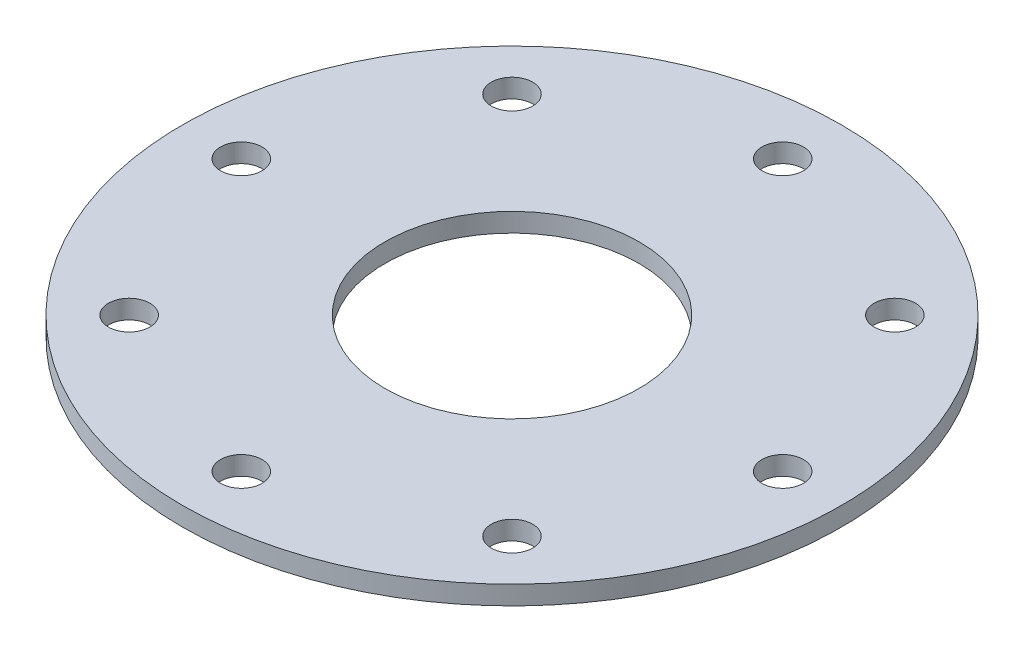
ISO-10303-21;
HEADER;
FILE_DESCRIPTION(('STEP AP214'),'2;1');
FILE_NAME('part.step','',(''),(''),'','','');
FILE_SCHEMA(('AUTOMOTIVE_DESIGN { 1 0 10303 214 1 1 1 1 }'));
ENDSEC;
DATA;
#1=APPLICATION_CONTEXT('core data for automotive mechanical design processes');
#2=APPLICATION_PROTOCOL_DEFINITION('international standard','automotive_design',2000,#1);
#3=PRODUCT_CONTEXT('',#1,'mechanical');
#4=PRODUCT('Part','Part','',(#3));
#5=PRODUCT_RELATED_PRODUCT_CATEGORY('part','',(#4));
#6=PRODUCT_DEFINITION_FORMATION('','',#4);
#7=PRODUCT_DEFINITION_CONTEXT('part definition',#1,'design');
#8=PRODUCT_DEFINITION('design','',#6,#7);
#9=PRODUCT_DEFINITION_SHAPE('','',#8);
#10=(LENGTH_UNIT() NAMED_UNIT(*) SI_UNIT(.MILLI.,.METRE.));
#11=(NAMED_UNIT(*) PLANE_ANGLE_UNIT() SI_UNIT($,.RADIAN.));
#12=(NAMED_UNIT(*) SI_UNIT($,.STERADIAN.) SOLID_ANGLE_UNIT());
#13=UNCERTAINTY_MEASURE_WITH_UNIT(LENGTH_MEASURE(1.E-05),#10,'distance_accuracy_value','');
#14=(GEOMETRIC_REPRESENTATION_CONTEXT(3) GLOBAL_UNCERTAINTY_ASSIGNED_CONTEXT((#13)) GLOBAL_UNIT_ASSIGNED_CONTEXT((#10,
#11,#12)) REPRESENTATION_CONTEXT('',''));
#15=CARTESIAN_POINT('',(0.,0.,0.));
#16=DIRECTION('',(0.,0.,1.));
#17=DIRECTION('',(1.,0.,0.));
#18=AXIS2_PLACEMENT_3D('',#15,#16,#17);
#19=CARTESIAN_POINT('',(0.,4.,0.));
#20=DIRECTION('',(0.,1.,0.));
#21=DIRECTION('',(0.,0.,1.));
#22=AXIS2_PLACEMENT_3D('',#19,#20,#21);
#23=PLANE('',#22);
#24=CARTESIAN_POINT('',(6.0228053095044E-13,4.,-57.5));
#25=DIRECTION('',(0.,1.,0.));
#26=DIRECTION('',(0.,0.,1.));
#27=AXIS2_PLACEMENT_3D('',#24,#25,#26);
#28=CIRCLE('',#27,4.4);
#29=CARTESIAN_POINT('',(6.0228053095044E-13,4.,-53.1));
#30=VERTEX_POINT('',#29);
#31=EDGE_CURVE('E88',#30,#30,#28,.T.);
#32=ORIENTED_EDGE('',*,*,#31,.F.);
#33=EDGE_LOOP('',(#32));
#34=FACE_BOUND('',#33,.T.);
#35=CARTESIAN_POINT('',(-57.5,4.,-4.1286418728248E-13));
#36=DIRECTION('',(0.,1.,0.));
#37=DIRECTION('',(0.,0.,1.));
#38=AXIS2_PLACEMENT_3D('',#35,#36,#37);
#39=CIRCLE('',#38,4.4);
#40=CARTESIAN_POINT('',(-57.5,4.,4.39999999999959));
#41=VERTEX_POINT('',#40);
#42=EDGE_CURVE('E76',#41,#41,#39,.T.);
#43=ORIENTED_EDGE('',*,*,#42,.F.);
#44=EDGE_LOOP('',(#43));
#45=FACE_BOUND('',#44,.T.);
#46=CARTESIAN_POINT('',(-1.03736463863413E-12,4.,57.5));
#47=DIRECTION('',(0.,1.,0.));
#48=DIRECTION('',(0.,0.,1.));
#49=AXIS2_PLACEMENT_3D('',#46,#47,#48);
#50=CIRCLE('',#49,4.4);
#51=CARTESIAN_POINT('',(-1.03736463863413E-12,4.,61.9));
#52=VERTEX_POINT('',#51);
#53=EDGE_CURVE('E64',#52,#52,#50,.T.);
#54=ORIENTED_EDGE('',*,*,#53,.F.);
#55=EDGE_LOOP('',(#54));
#56=FACE_BOUND('',#55,.T.);
#57=CARTESIAN_POINT('',(57.5,4.,0.));
#58=DIRECTION('',(0.,1.,0.));
#59=DIRECTION('',(0.,0.,1.));
#60=AXIS2_PLACEMENT_3D('',#57,#58,#59);
#61=CIRCLE('',#60,4.4);
#62=CARTESIAN_POINT('',(57.5,4.,4.4));
#63=VERTEX_POINT('',#62);
#64=EDGE_CURVE('E52',#63,#63,#61,.T.);
#65=ORIENTED_EDGE('',*,*,#64,.F.);
#66=EDGE_LOOP('',(#65));
#67=FACE_BOUND('',#66,.T.);
#68=CARTESIAN_POINT('',(0.,4.,0.));
#69=DIRECTION('',(0.,1.,0.));
#70=DIRECTION('',(0.,0.,1.));
#71=AXIS2_PLACEMENT_3D('',#68,#69,#70);
#72=CIRCLE('',#71,70.);
#73=CARTESIAN_POINT('',(0.,4.,70.));
#74=VERTEX_POINT('',#73);
#75=EDGE_CURVE('E10',#74,#74,#72,.T.);
#76=ORIENTED_EDGE('',*,*,#75,.T.);
#77=EDGE_LOOP('',(#76));
#78=FACE_BOUND('',#77,.T.);
#79=CARTESIAN_POINT('',(0.,4.,0.));
#80=DIRECTION('',(0.,1.,0.));
#81=DIRECTION('',(0.,0.,1.));
#82=AXIS2_PLACEMENT_3D('',#79,#80,#81);
#83=CIRCLE('',#82,27.);
#84=CARTESIAN_POINT('',(0.,4.,27.));
#85=VERTEX_POINT('',#84);
#86=EDGE_CURVE('E47',#85,#85,#83,.T.);
#87=ORIENTED_EDGE('',*,*,#86,.F.);
#88=EDGE_LOOP('',(#87));
#89=FACE_BOUND('',#88,.T.);
#90=CARTESIAN_POINT('',(40.6586399182258,4.,40.6586399182271));
#91=DIRECTION('',(0.,1.,0.));
#92=DIRECTION('',(0.,0.,1.));
#93=AXIS2_PLACEMENT_3D('',#90,#91,#92);
#94=CIRCLE('',#93,4.4);
#95=CARTESIAN_POINT('',(40.6586399182258,4.,45.0586399182271));
#96=VERTEX_POINT('',#95);
#97=EDGE_CURVE('E58',#96,#96,#94,.T.);
#98=ORIENTED_EDGE('',*,*,#97,.F.);
#99=EDGE_LOOP('',(#98));
#100=FACE_BOUND('',#99,.T.);
#101=CARTESIAN_POINT('',(-40.6586399182273,4.,40.6586399182257));
#102=DIRECTION('',(0.,1.,0.));
#103=DIRECTION('',(0.,0.,1.));
#104=AXIS2_PLACEMENT_3D('',#101,#102,#103);
#105=CIRCLE('',#104,4.4);
#106=CARTESIAN_POINT('',(-40.6586399182273,4.,45.0586399182257));
#107=VERTEX_POINT('',#106);
#108=EDGE_CURVE('E70',#107,#107,#105,.T.);
#109=ORIENTED_EDGE('',*,*,#108,.F.);
#110=EDGE_LOOP('',(#109));
#111=FACE_BOUND('',#110,.T.);
#112=CARTESIAN_POINT('',(-40.6586399182261,4.,-40.6586399182268));
#113=DIRECTION('',(0.,1.,0.));
#114=DIRECTION('',(0.,0.,1.));
#115=AXIS2_PLACEMENT_3D('',#112,#113,#114);
#116=CIRCLE('',#115,4.4);
#117=CARTESIAN_POINT('',(-40.6586399182261,4.,-36.2586399182268));
#118=VERTEX_POINT('',#117);
#119=EDGE_CURVE('E82',#118,#118,#116,.T.);
#120=ORIENTED_EDGE('',*,*,#119,.F.);
#121=EDGE_LOOP('',(#120));
#122=FACE_BOUND('',#121,.T.);
#123=CARTESIAN_POINT('',(40.658639918227,4.,-40.658639918226));
#124=DIRECTION('',(0.,1.,0.));
#125=DIRECTION('',(0.,0.,1.));
#126=AXIS2_PLACEMENT_3D('',#123,#124,#125);
#127=CIRCLE('',#126,4.4);
#128=CARTESIAN_POINT('',(40.658639918227,4.,-36.258639918226));
#129=VERTEX_POINT('',#128);
#130=EDGE_CURVE('E94',#129,#129,#127,.T.);
#131=ORIENTED_EDGE('',*,*,#130,.F.);
#132=EDGE_LOOP('',(#131));
#133=FACE_BOUND('',#132,.T.);
#134=ADVANCED_FACE('F36',(#34,#45,#56,#67,#78,#89,#100,#111,#122,#133),#23,.T.);
#135=CARTESIAN_POINT('',(0.,0.,0.));
#136=DIRECTION('',(0.,1.,0.));
#137=DIRECTION('',(0.,0.,1.));
#138=AXIS2_PLACEMENT_3D('',#135,#136,#137);
#139=PLANE('',#138);
#140=CARTESIAN_POINT('',(0.,0.,0.));
#141=DIRECTION('',(0.,1.,0.));
#142=DIRECTION('',(0.,0.,1.));
#143=AXIS2_PLACEMENT_3D('',#140,#141,#142);
#144=CIRCLE('',#143,70.);
#145=CARTESIAN_POINT('',(0.,0.,70.));
#146=VERTEX_POINT('',#145);
#147=EDGE_CURVE('E40',#146,#146,#144,.T.);
#148=ORIENTED_EDGE('',*,*,#147,.F.);
#149=EDGE_LOOP('',(#148));
#150=FACE_BOUND('',#149,.T.);
#151=CARTESIAN_POINT('',(0.,0.,0.));
#152=DIRECTION('',(0.,1.,0.));
#153=DIRECTION('',(0.,0.,1.));
#154=AXIS2_PLACEMENT_3D('',#151,#152,#153);
#155=CIRCLE('',#154,27.);
#156=CARTESIAN_POINT('',(0.,0.,27.));
#157=VERTEX_POINT('',#156);
#158=EDGE_CURVE('E49',#157,#157,#155,.T.);
#159=ORIENTED_EDGE('',*,*,#158,.T.);
#160=EDGE_LOOP('',(#159));
#161=FACE_BOUND('',#160,.T.);
#162=CARTESIAN_POINT('',(57.5,0.,0.));
#163=DIRECTION('',(0.,1.,0.));
#164=DIRECTION('',(0.,0.,1.));
#165=AXIS2_PLACEMENT_3D('',#162,#163,#164);
#166=CIRCLE('',#165,4.4);
#167=CARTESIAN_POINT('',(57.5,0.,4.4));
#168=VERTEX_POINT('',#167);
#169=EDGE_CURVE('E55',#168,#168,#166,.T.);
#170=ORIENTED_EDGE('',*,*,#169,.T.);
#171=EDGE_LOOP('',(#170));
#172=FACE_BOUND('',#171,.T.);
#173=CARTESIAN_POINT('',(40.6586399182258,0.,40.6586399182271));
#174=DIRECTION('',(0.,1.,0.));
#175=DIRECTION('',(0.,0.,1.));
#176=AXIS2_PLACEMENT_3D('',#173,#174,#175);
#177=CIRCLE('',#176,4.4);
#178=CARTESIAN_POINT('',(40.6586399182258,0.,45.0586399182271));
#179=VERTEX_POINT('',#178);
#180=EDGE_CURVE('E61',#179,#179,#177,.T.);
#181=ORIENTED_EDGE('',*,*,#180,.T.);
#182=EDGE_LOOP('',(#181));
#183=FACE_BOUND('',#182,.T.);
#184=CARTESIAN_POINT('',(-1.03736463863413E-12,0.,57.5));
#185=DIRECTION('',(0.,1.,0.));
#186=DIRECTION('',(0.,0.,1.));
#187=AXIS2_PLACEMENT_3D('',#184,#185,#186);
#188=CIRCLE('',#187,4.4);
#189=CARTESIAN_POINT('',(-1.03736463863413E-12,0.,61.9));
#190=VERTEX_POINT('',#189);
#191=EDGE_CURVE('E67',#190,#190,#188,.T.);
#192=ORIENTED_EDGE('',*,*,#191,.T.);
#193=EDGE_LOOP('',(#192));
#194=FACE_BOUND('',#193,.T.);
#195=CARTESIAN_POINT('',(-40.6586399182273,0.,40.6586399182257));
#196=DIRECTION('',(0.,1.,0.));
#197=DIRECTION('',(0.,0.,1.));
#198=AXIS2_PLACEMENT_3D('',#195,#196,#197);
#199=CIRCLE('',#198,4.4);
#200=CARTESIAN_POINT('',(-40.6586399182273,0.,45.0586399182257));
#201=VERTEX_POINT('',#200);
#202=EDGE_CURVE('E73',#201,#201,#199,.T.);
#203=ORIENTED_EDGE('',*,*,#202,.T.);
#204=EDGE_LOOP('',(#203));
#205=FACE_BOUND('',#204,.T.);
#206=CARTESIAN_POINT('',(-57.5,0.,-4.1286418728248E-13));
#207=DIRECTION('',(0.,1.,0.));
#208=DIRECTION('',(0.,0.,1.));
#209=AXIS2_PLACEMENT_3D('',#206,#207,#208);
#210=CIRCLE('',#209,4.4);
#211=CARTESIAN_POINT('',(-57.5,0.,4.39999999999959));
#212=VERTEX_POINT('',#211);
#213=EDGE_CURVE('E79',#212,#212,#210,.T.);
#214=ORIENTED_EDGE('',*,*,#213,.T.);
#215=EDGE_LOOP('',(#214));
#216=FACE_BOUND('',#215,.T.);
#217=CARTESIAN_POINT('',(-40.6586399182261,0.,-40.6586399182268));
#218=DIRECTION('',(0.,1.,0.));
#219=DIRECTION('',(0.,0.,1.));
#220=AXIS2_PLACEMENT_3D('',#217,#218,#219);
#221=CIRCLE('',#220,4.4);
#222=CARTESIAN_POINT('',(-40.6586399182261,0.,-36.2586399182268));
#223=VERTEX_POINT('',#222);
#224=EDGE_CURVE('E85',#223,#223,#221,.T.);
#225=ORIENTED_EDGE('',*,*,#224,.T.);
#226=EDGE_LOOP('',(#225));
#227=FACE_BOUND('',#226,.T.);
#228=CARTESIAN_POINT('',(6.0228053095044E-13,0.,-57.5));
#229=DIRECTION('',(0.,1.,0.));
#230=DIRECTION('',(0.,0.,1.));
#231=AXIS2_PLACEMENT_3D('',#228,#229,#230);
#232=CIRCLE('',#231,4.4);
#233=CARTESIAN_POINT('',(6.0228053095044E-13,0.,-53.1));
#234=VERTEX_POINT('',#233);
#235=EDGE_CURVE('E91',#234,#234,#232,.T.);
#236=ORIENTED_EDGE('',*,*,#235,.T.);
#237=EDGE_LOOP('',(#236));
#238=FACE_BOUND('',#237,.T.);
#239=CARTESIAN_POINT('',(40.658639918227,0.,-40.658639918226));
#240=DIRECTION('',(0.,1.,0.));
#241=DIRECTION('',(0.,0.,1.));
#242=AXIS2_PLACEMENT_3D('',#239,#240,#241);
#243=CIRCLE('',#242,4.4);
#244=CARTESIAN_POINT('',(40.658639918227,0.,-36.258639918226));
#245=VERTEX_POINT('',#244);
#246=EDGE_CURVE('E97',#245,#245,#243,.T.);
#247=ORIENTED_EDGE('',*,*,#246,.T.);
#248=EDGE_LOOP('',(#247));
#249=FACE_BOUND('',#248,.T.);
#250=ADVANCED_FACE('F107',(#150,#161,#172,#183,#194,#205,#216,#227,#238,#249),#139,.F.);
#251=CARTESIAN_POINT('',(0.,4.,0.));
#252=DIRECTION('',(0.,-1.,0.));
#253=DIRECTION('',(0.,0.,-1.));
#254=AXIS2_PLACEMENT_3D('',#251,#252,#253);
#255=CYLINDRICAL_SURFACE('',#254,70.);
#256=ORIENTED_EDGE('',*,*,#75,.F.);
#257=EDGE_LOOP('',(#256));
#258=FACE_BOUND('',#257,.T.);
#259=ORIENTED_EDGE('',*,*,#147,.T.);
#260=EDGE_LOOP('',(#259));
#261=FACE_BOUND('',#260,.T.);
#262=ADVANCED_FACE('F38',(#258,#261),#255,.T.);
#263=CARTESIAN_POINT('',(0.,4.,0.));
#264=DIRECTION('',(0.,-1.,0.));
#265=DIRECTION('',(0.,0.,-1.));
#266=AXIS2_PLACEMENT_3D('',#263,#264,#265);
#267=CYLINDRICAL_SURFACE('',#266,27.);
#268=ORIENTED_EDGE('',*,*,#86,.T.);
#269=EDGE_LOOP('',(#268));
#270=FACE_BOUND('',#269,.T.);
#271=ORIENTED_EDGE('',*,*,#158,.F.);
#272=EDGE_LOOP('',(#271));
#273=FACE_BOUND('',#272,.T.);
#274=ADVANCED_FACE('F117',(#270,#273),#267,.F.);
#275=CARTESIAN_POINT('',(57.5,4.,0.));
#276=DIRECTION('',(0.,-1.,0.));
#277=DIRECTION('',(0.,0.,-1.));
#278=AXIS2_PLACEMENT_3D('',#275,#276,#277);
#279=CYLINDRICAL_SURFACE('',#278,4.4);
#280=ORIENTED_EDGE('',*,*,#64,.T.);
#281=EDGE_LOOP('',(#280));
#282=FACE_BOUND('',#281,.T.);
#283=ORIENTED_EDGE('',*,*,#169,.F.);
#284=EDGE_LOOP('',(#283));
#285=FACE_BOUND('',#284,.T.);
#286=ADVANCED_FACE('F120',(#282,#285),#279,.F.);
#287=CARTESIAN_POINT('',(40.6586399182258,4.,40.6586399182271));
#288=DIRECTION('',(0.,-1.,0.));
#289=DIRECTION('',(0.,0.,-1.));
#290=AXIS2_PLACEMENT_3D('',#287,#288,#289);
#291=CYLINDRICAL_SURFACE('',#290,4.4);
#292=ORIENTED_EDGE('',*,*,#97,.T.);
#293=EDGE_LOOP('',(#292));
#294=FACE_BOUND('',#293,.T.);
#295=ORIENTED_EDGE('',*,*,#180,.F.);
#296=EDGE_LOOP('',(#295));
#297=FACE_BOUND('',#296,.T.);
#298=ADVANCED_FACE('F124',(#294,#297),#291,.F.);
#299=CARTESIAN_POINT('',(-1.03736463863413E-12,4.,57.5));
#300=DIRECTION('',(0.,-1.,0.));
#301=DIRECTION('',(0.,0.,-1.));
#302=AXIS2_PLACEMENT_3D('',#299,#300,#301);
#303=CYLINDRICAL_SURFACE('',#302,4.4);
#304=ORIENTED_EDGE('',*,*,#53,.T.);
#305=EDGE_LOOP('',(#304));
#306=FACE_BOUND('',#305,.T.);
#307=ORIENTED_EDGE('',*,*,#191,.F.);
#308=EDGE_LOOP('',(#307));
#309=FACE_BOUND('',#308,.T.);
#310=ADVANCED_FACE('F128',(#306,#309),#303,.F.);
#311=CARTESIAN_POINT('',(-40.6586399182273,4.,40.6586399182257));
#312=DIRECTION('',(0.,-1.,0.));
#313=DIRECTION('',(0.,0.,-1.));
#314=AXIS2_PLACEMENT_3D('',#311,#312,#313);
#315=CYLINDRICAL_SURFACE('',#314,4.4);
#316=ORIENTED_EDGE('',*,*,#108,.T.);
#317=EDGE_LOOP('',(#316));
#318=FACE_BOUND('',#317,.T.);
#319=ORIENTED_EDGE('',*,*,#202,.F.);
#320=EDGE_LOOP('',(#319));
#321=FACE_BOUND('',#320,.T.);
#322=ADVANCED_FACE('F132',(#318,#321),#315,.F.);
#323=CARTESIAN_POINT('',(-57.5,4.,-4.1286418728248E-13));
#324=DIRECTION('',(0.,-1.,0.));
#325=DIRECTION('',(0.,0.,-1.));
#326=AXIS2_PLACEMENT_3D('',#323,#324,#325);
#327=CYLINDRICAL_SURFACE('',#326,4.4);
#328=ORIENTED_EDGE('',*,*,#42,.T.);
#329=EDGE_LOOP('',(#328));
#330=FACE_BOUND('',#329,.T.);
#331=ORIENTED_EDGE('',*,*,#213,.F.);
#332=EDGE_LOOP('',(#331));
#333=FACE_BOUND('',#332,.T.);
#334=ADVANCED_FACE('F136',(#330,#333),#327,.F.);
#335=CARTESIAN_POINT('',(-40.6586399182261,4.,-40.6586399182268));
#336=DIRECTION('',(0.,-1.,0.));
#337=DIRECTION('',(0.,0.,-1.));
#338=AXIS2_PLACEMENT_3D('',#335,#336,#337);
#339=CYLINDRICAL_SURFACE('',#338,4.4);
#340=ORIENTED_EDGE('',*,*,#119,.T.);
#341=EDGE_LOOP('',(#340));
#342=FACE_BOUND('',#341,.T.);
#343=ORIENTED_EDGE('',*,*,#224,.F.);
#344=EDGE_LOOP('',(#343));
#345=FACE_BOUND('',#344,.T.);
#346=ADVANCED_FACE('F140',(#342,#345),#339,.F.);
#347=CARTESIAN_POINT('',(6.0228053095044E-13,4.,-57.5));
#348=DIRECTION('',(0.,-1.,0.));
#349=DIRECTION('',(0.,0.,-1.));
#350=AXIS2_PLACEMENT_3D('',#347,#348,#349);
#351=CYLINDRICAL_SURFACE('',#350,4.4);
#352=ORIENTED_EDGE('',*,*,#31,.T.);
#353=EDGE_LOOP('',(#352));
#354=FACE_BOUND('',#353,.T.);
#355=ORIENTED_EDGE('',*,*,#235,.F.);
#356=EDGE_LOOP('',(#355));
#357=FACE_BOUND('',#356,.T.);
#358=ADVANCED_FACE('F144',(#354,#357),#351,.F.);
#359=CARTESIAN_POINT('',(40.658639918227,4.,-40.658639918226));
#360=DIRECTION('',(0.,-1.,0.));
#361=DIRECTION('',(0.,0.,-1.));
#362=AXIS2_PLACEMENT_3D('',#359,#360,#361);
#363=CYLINDRICAL_SURFACE('',#362,4.4);
#364=ORIENTED_EDGE('',*,*,#130,.T.);
#365=EDGE_LOOP('',(#364));
#366=FACE_BOUND('',#365,.T.);
#367=ORIENTED_EDGE('',*,*,#246,.F.);
#368=EDGE_LOOP('',(#367));
#369=FACE_BOUND('',#368,.T.);
#370=ADVANCED_FACE('F103',(#366,#369),#363,.F.);
#371=CLOSED_SHELL('',(#134,#250,#262,#274,#286,#298,#310,#322,#334,#346,#358,#370));
#372=MANIFOLD_SOLID_BREP('B2',#371);
#373=ADVANCED_BREP_SHAPE_REPRESENTATION('',(#18,#372),#14);
#374=SHAPE_DEFINITION_REPRESENTATION(#9,#373);
ENDSEC;
END-ISO-10303-21;
